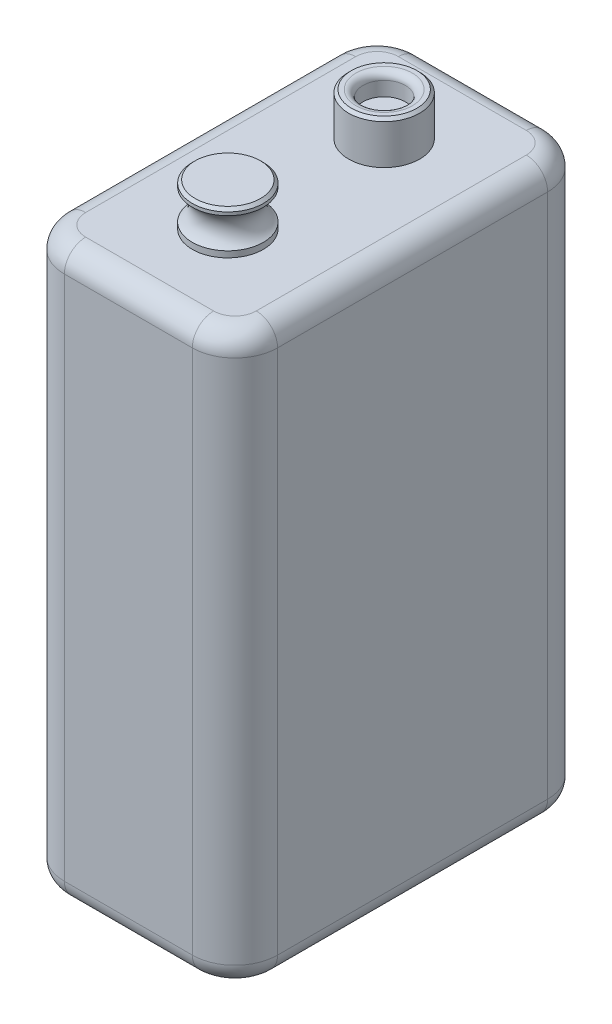
ISO-10303-21;
HEADER;
FILE_DESCRIPTION(('STEP AP214'),'2;1');
FILE_NAME('part.step','',(''),(''),'','','');
FILE_SCHEMA(('AUTOMOTIVE_DESIGN { 1 0 10303 214 1 1 1 1 }'));
ENDSEC;
DATA;
#1=APPLICATION_CONTEXT('core data for automotive mechanical design processes');
#2=APPLICATION_PROTOCOL_DEFINITION('international standard','automotive_design',2000,#1);
#3=PRODUCT_CONTEXT('',#1,'mechanical');
#4=PRODUCT('Part','Part','',(#3));
#5=PRODUCT_RELATED_PRODUCT_CATEGORY('part','',(#4));
#6=PRODUCT_DEFINITION_FORMATION('','',#4);
#7=PRODUCT_DEFINITION_CONTEXT('part definition',#1,'design');
#8=PRODUCT_DEFINITION('design','',#6,#7);
#9=PRODUCT_DEFINITION_SHAPE('','',#8);
#10=(LENGTH_UNIT() NAMED_UNIT(*) SI_UNIT(.MILLI.,.METRE.));
#11=(NAMED_UNIT(*) PLANE_ANGLE_UNIT() SI_UNIT($,.RADIAN.));
#12=(NAMED_UNIT(*) SI_UNIT($,.STERADIAN.) SOLID_ANGLE_UNIT());
#13=UNCERTAINTY_MEASURE_WITH_UNIT(LENGTH_MEASURE(1.E-05),#10,'distance_accuracy_value','');
#14=(GEOMETRIC_REPRESENTATION_CONTEXT(3) GLOBAL_UNCERTAINTY_ASSIGNED_CONTEXT((#13)) GLOBAL_UNIT_ASSIGNED_CONTEXT((#10,
#11,#12)) REPRESENTATION_CONTEXT('',''));
#15=CARTESIAN_POINT('',(0.,0.,0.));
#16=DIRECTION('',(0.,0.,1.));
#17=DIRECTION('',(1.,0.,0.));
#18=AXIS2_PLACEMENT_3D('',#15,#16,#17);
#19=CARTESIAN_POINT('',(0.,43.,5.49999999999999));
#20=DIRECTION('',(0.,-1.,0.));
#21=DIRECTION('',(0.,0.,-1.));
#22=AXIS2_PLACEMENT_3D('',#19,#20,#21);
#23=CYLINDRICAL_SURFACE('',#22,2.5);
#24=CARTESIAN_POINT('',(0.,40.,5.49999999999999));
#25=DIRECTION('',(0.,1.,0.));
#26=DIRECTION('',(0.,0.,-1.));
#27=AXIS2_PLACEMENT_3D('',#24,#25,#26);
#28=CIRCLE('',#27,2.5);
#29=CARTESIAN_POINT('',(0.,40.,2.99999999999999));
#30=VERTEX_POINT('',#29);
#31=EDGE_CURVE('E458',#30,#30,#28,.T.);
#32=ORIENTED_EDGE('',*,*,#31,.T.);
#33=EDGE_LOOP('',(#32));
#34=FACE_BOUND('',#33,.T.);
#35=CARTESIAN_POINT('',(0.,40.4314612308124,5.49999999999999));
#36=DIRECTION('',(0.,1.,0.));
#37=DIRECTION('',(0.,0.,1.));
#38=AXIS2_PLACEMENT_3D('',#35,#36,#37);
#39=CIRCLE('',#38,2.5);
#40=CARTESIAN_POINT('',(0.,40.4314612308124,7.99999999999999));
#41=VERTEX_POINT('',#40);
#42=EDGE_CURVE('E298',#41,#41,#39,.T.);
#43=ORIENTED_EDGE('',*,*,#42,.F.);
#44=EDGE_LOOP('',(#43));
#45=FACE_BOUND('',#44,.T.);
#46=ADVANCED_FACE('F38',(#34,#45),#23,.T.);
#47=CARTESIAN_POINT('',(7.5,40.,-12.5));
#48=DIRECTION('',(-1.,0.,0.));
#49=DIRECTION('',(0.,0.,1.));
#50=AXIS2_PLACEMENT_3D('',#47,#48,#49);
#51=PLANE('',#50);
#52=DIRECTION('',(0.,-1.,0.));
#53=VECTOR('',#52,1.);
#54=CARTESIAN_POINT('',(7.5,40.,-9.50000000000001));
#55=LINE('',#54,#53);
#56=CARTESIAN_POINT('',(7.5,1.5,-9.50000000000001));
#57=VERTEX_POINT('',#56);
#58=CARTESIAN_POINT('',(7.5,38.5,-9.50000000000001));
#59=VERTEX_POINT('',#58);
#60=EDGE_CURVE('E474',#57,#59,#55,.F.);
#61=ORIENTED_EDGE('',*,*,#60,.T.);
#62=DIRECTION('',(0.,0.,-1.));
#63=VECTOR('',#62,1.);
#64=CARTESIAN_POINT('',(7.5,38.5,9.49999999999999));
#65=LINE('',#64,#63);
#66=CARTESIAN_POINT('',(7.5,38.5,9.49999999999999));
#67=VERTEX_POINT('',#66);
#68=EDGE_CURVE('E262',#59,#67,#65,.F.);
#69=ORIENTED_EDGE('',*,*,#68,.T.);
#70=DIRECTION('',(0.,-1.,0.));
#71=VECTOR('',#70,1.);
#72=CARTESIAN_POINT('',(7.5,40.,9.49999999999999));
#73=LINE('',#72,#71);
#74=CARTESIAN_POINT('',(7.5,1.5,9.49999999999999));
#75=VERTEX_POINT('',#74);
#76=EDGE_CURVE('E472',#67,#75,#73,.T.);
#77=ORIENTED_EDGE('',*,*,#76,.T.);
#78=DIRECTION('',(0.,0.,-1.));
#79=VECTOR('',#78,1.);
#80=CARTESIAN_POINT('',(7.5,1.5,-12.5));
#81=LINE('',#80,#79);
#82=EDGE_CURVE('E213',#75,#57,#81,.T.);
#83=ORIENTED_EDGE('',*,*,#82,.T.);
#84=EDGE_LOOP('',(#61,#69,#77,#83));
#85=FACE_BOUND('',#84,.T.);
#86=ADVANCED_FACE('F319',(#85),#51,.F.);
#87=CARTESIAN_POINT('',(-7.5,40.,-12.5));
#88=DIRECTION('',(0.,0.,1.));
#89=DIRECTION('',(1.,0.,0.));
#90=AXIS2_PLACEMENT_3D('',#87,#88,#89);
#91=PLANE('',#90);
#92=DIRECTION('',(0.,-1.,0.));
#93=VECTOR('',#92,1.);
#94=CARTESIAN_POINT('',(-4.5,40.,-12.5));
#95=LINE('',#94,#93);
#96=CARTESIAN_POINT('',(-4.5,1.5,-12.5));
#97=VERTEX_POINT('',#96);
#98=CARTESIAN_POINT('',(-4.5,38.5,-12.5));
#99=VERTEX_POINT('',#98);
#100=EDGE_CURVE('E470',#97,#99,#95,.F.);
#101=ORIENTED_EDGE('',*,*,#100,.T.);
#102=DIRECTION('',(-1.,0.,0.));
#103=VECTOR('',#102,1.);
#104=CARTESIAN_POINT('',(4.5,38.5,-12.5));
#105=LINE('',#104,#103);
#106=CARTESIAN_POINT('',(4.5,38.5,-12.5));
#107=VERTEX_POINT('',#106);
#108=EDGE_CURVE('E61',#99,#107,#105,.F.);
#109=ORIENTED_EDGE('',*,*,#108,.T.);
#110=DIRECTION('',(0.,-1.,0.));
#111=VECTOR('',#110,1.);
#112=CARTESIAN_POINT('',(4.5,40.,-12.5));
#113=LINE('',#112,#111);
#114=CARTESIAN_POINT('',(4.5,1.5,-12.5));
#115=VERTEX_POINT('',#114);
#116=EDGE_CURVE('E468',#107,#115,#113,.T.);
#117=ORIENTED_EDGE('',*,*,#116,.T.);
#118=DIRECTION('',(-1.,0.,0.));
#119=VECTOR('',#118,1.);
#120=CARTESIAN_POINT('',(-7.5,1.5,-12.5));
#121=LINE('',#120,#119);
#122=EDGE_CURVE('E210',#115,#97,#121,.T.);
#123=ORIENTED_EDGE('',*,*,#122,.T.);
#124=EDGE_LOOP('',(#101,#109,#117,#123));
#125=FACE_BOUND('',#124,.T.);
#126=ADVANCED_FACE('F324',(#125),#91,.F.);
#127=CARTESIAN_POINT('',(-7.5,40.,-12.5));
#128=DIRECTION('',(1.,0.,0.));
#129=DIRECTION('',(0.,0.,-1.));
#130=AXIS2_PLACEMENT_3D('',#127,#128,#129);
#131=PLANE('',#130);
#132=DIRECTION('',(0.,-1.,0.));
#133=VECTOR('',#132,1.);
#134=CARTESIAN_POINT('',(-7.5,40.,9.49999999999999));
#135=LINE('',#134,#133);
#136=CARTESIAN_POINT('',(-7.5,1.5,9.49999999999999));
#137=VERTEX_POINT('',#136);
#138=CARTESIAN_POINT('',(-7.5,38.5,9.49999999999999));
#139=VERTEX_POINT('',#138);
#140=EDGE_CURVE('E232',#137,#139,#135,.F.);
#141=ORIENTED_EDGE('',*,*,#140,.T.);
#142=DIRECTION('',(0.,0.,1.));
#143=VECTOR('',#142,1.);
#144=CARTESIAN_POINT('',(-7.5,38.5,-9.50000000000001));
#145=LINE('',#144,#143);
#146=CARTESIAN_POINT('',(-7.5,38.5,-9.50000000000001));
#147=VERTEX_POINT('',#146);
#148=EDGE_CURVE('E256',#139,#147,#145,.F.);
#149=ORIENTED_EDGE('',*,*,#148,.T.);
#150=DIRECTION('',(0.,-1.,0.));
#151=VECTOR('',#150,1.);
#152=CARTESIAN_POINT('',(-7.5,40.,-9.50000000000001));
#153=LINE('',#152,#151);
#154=CARTESIAN_POINT('',(-7.5,1.5,-9.50000000000001));
#155=VERTEX_POINT('',#154);
#156=EDGE_CURVE('E466',#147,#155,#153,.T.);
#157=ORIENTED_EDGE('',*,*,#156,.T.);
#158=DIRECTION('',(0.,0.,1.));
#159=VECTOR('',#158,1.);
#160=CARTESIAN_POINT('',(-7.5,1.5,-12.5));
#161=LINE('',#160,#159);
#162=EDGE_CURVE('E205',#155,#137,#161,.T.);
#163=ORIENTED_EDGE('',*,*,#162,.T.);
#164=EDGE_LOOP('',(#141,#149,#157,#163));
#165=FACE_BOUND('',#164,.T.);
#166=ADVANCED_FACE('F352',(#165),#131,.F.);
#167=CARTESIAN_POINT('',(-7.5,40.,12.5));
#168=DIRECTION('',(0.,0.,-1.));
#169=DIRECTION('',(-1.,0.,0.));
#170=AXIS2_PLACEMENT_3D('',#167,#168,#169);
#171=PLANE('',#170);
#172=DIRECTION('',(0.,-1.,0.));
#173=VECTOR('',#172,1.);
#174=CARTESIAN_POINT('',(4.5,40.,12.5));
#175=LINE('',#174,#173);
#176=CARTESIAN_POINT('',(4.5,1.5,12.5));
#177=VERTEX_POINT('',#176);
#178=CARTESIAN_POINT('',(4.5,38.5,12.5));
#179=VERTEX_POINT('',#178);
#180=EDGE_CURVE('E182',#177,#179,#175,.F.);
#181=ORIENTED_EDGE('',*,*,#180,.T.);
#182=DIRECTION('',(1.,0.,0.));
#183=VECTOR('',#182,1.);
#184=CARTESIAN_POINT('',(-4.5,38.5,12.5));
#185=LINE('',#184,#183);
#186=CARTESIAN_POINT('',(-4.5,38.5,12.5));
#187=VERTEX_POINT('',#186);
#188=EDGE_CURVE('E252',#179,#187,#185,.F.);
#189=ORIENTED_EDGE('',*,*,#188,.T.);
#190=DIRECTION('',(0.,-1.,0.));
#191=VECTOR('',#190,1.);
#192=CARTESIAN_POINT('',(-4.5,40.,12.5));
#193=LINE('',#192,#191);
#194=CARTESIAN_POINT('',(-4.5,1.5,12.5));
#195=VERTEX_POINT('',#194);
#196=EDGE_CURVE('E180',#187,#195,#193,.T.);
#197=ORIENTED_EDGE('',*,*,#196,.T.);
#198=DIRECTION('',(1.,0.,0.));
#199=VECTOR('',#198,1.);
#200=CARTESIAN_POINT('',(-7.5,1.5,12.5));
#201=LINE('',#200,#199);
#202=EDGE_CURVE('E200',#195,#177,#201,.T.);
#203=ORIENTED_EDGE('',*,*,#202,.T.);
#204=EDGE_LOOP('',(#181,#189,#197,#203));
#205=FACE_BOUND('',#204,.T.);
#206=ADVANCED_FACE('F345',(#205),#171,.F.);
#207=CARTESIAN_POINT('',(0.,40.,0.));
#208=DIRECTION('',(0.,1.,0.));
#209=DIRECTION('',(0.,0.,1.));
#210=AXIS2_PLACEMENT_3D('',#207,#208,#209);
#211=PLANE('',#210);
#212=ORIENTED_EDGE('',*,*,#31,.F.);
#213=EDGE_LOOP('',(#212));
#214=FACE_BOUND('',#213,.T.);
#215=CARTESIAN_POINT('',(0.,40.,-5.5));
#216=DIRECTION('',(0.,1.,0.));
#217=DIRECTION('',(0.,0.,1.));
#218=AXIS2_PLACEMENT_3D('',#215,#216,#217);
#219=CIRCLE('',#218,2.5);
#220=CARTESIAN_POINT('',(0.,40.,-3.));
#221=VERTEX_POINT('',#220);
#222=EDGE_CURVE('E268',#221,#221,#219,.T.);
#223=ORIENTED_EDGE('',*,*,#222,.F.);
#224=EDGE_LOOP('',(#223));
#225=FACE_BOUND('',#224,.T.);
#226=DIRECTION('',(1.,0.,0.));
#227=VECTOR('',#226,1.);
#228=CARTESIAN_POINT('',(4.5,40.,11.));
#229=LINE('',#228,#227);
#230=CARTESIAN_POINT('',(-4.5,40.,11.));
#231=VERTEX_POINT('',#230);
#232=CARTESIAN_POINT('',(4.5,40.,11.));
#233=VERTEX_POINT('',#232);
#234=EDGE_CURVE('E244',#231,#233,#229,.T.);
#235=ORIENTED_EDGE('',*,*,#234,.T.);
#236=CARTESIAN_POINT('',(4.5,40.,9.49999999999999));
#237=DIRECTION('',(0.,1.,0.));
#238=DIRECTION('',(0.,0.,1.));
#239=AXIS2_PLACEMENT_3D('',#236,#237,#238);
#240=CIRCLE('',#239,1.5);
#241=CARTESIAN_POINT('',(6.,40.,9.49999999999999));
#242=VERTEX_POINT('',#241);
#243=EDGE_CURVE('E246',#233,#242,#240,.T.);
#244=ORIENTED_EDGE('',*,*,#243,.T.);
#245=DIRECTION('',(0.,0.,-1.));
#246=VECTOR('',#245,1.);
#247=CARTESIAN_POINT('',(6.,40.,-9.50000000000001));
#248=LINE('',#247,#246);
#249=CARTESIAN_POINT('',(6.,40.,-9.50000000000001));
#250=VERTEX_POINT('',#249);
#251=EDGE_CURVE('E215',#242,#250,#248,.T.);
#252=ORIENTED_EDGE('',*,*,#251,.T.);
#253=CARTESIAN_POINT('',(4.5,40.,-9.50000000000001));
#254=DIRECTION('',(0.,1.,0.));
#255=DIRECTION('',(0.,0.,1.));
#256=AXIS2_PLACEMENT_3D('',#253,#254,#255);
#257=CIRCLE('',#256,1.5);
#258=CARTESIAN_POINT('',(4.5,40.,-11.));
#259=VERTEX_POINT('',#258);
#260=EDGE_CURVE('E234',#250,#259,#257,.T.);
#261=ORIENTED_EDGE('',*,*,#260,.T.);
#262=DIRECTION('',(-1.,0.,0.));
#263=VECTOR('',#262,1.);
#264=CARTESIAN_POINT('',(-4.5,40.,-11.));
#265=LINE('',#264,#263);
#266=CARTESIAN_POINT('',(-4.5,40.,-11.));
#267=VERTEX_POINT('',#266);
#268=EDGE_CURVE('E236',#259,#267,#265,.T.);
#269=ORIENTED_EDGE('',*,*,#268,.T.);
#270=CARTESIAN_POINT('',(-4.5,40.,-9.50000000000001));
#271=DIRECTION('',(0.,1.,0.));
#272=DIRECTION('',(0.,0.,1.));
#273=AXIS2_PLACEMENT_3D('',#270,#271,#272);
#274=CIRCLE('',#273,1.5);
#275=CARTESIAN_POINT('',(-6.,40.,-9.50000000000001));
#276=VERTEX_POINT('',#275);
#277=EDGE_CURVE('E238',#267,#276,#274,.T.);
#278=ORIENTED_EDGE('',*,*,#277,.T.);
#279=DIRECTION('',(0.,0.,1.));
#280=VECTOR('',#279,1.);
#281=CARTESIAN_POINT('',(-6.,40.,9.49999999999999));
#282=LINE('',#281,#280);
#283=CARTESIAN_POINT('',(-6.,40.,9.49999999999999));
#284=VERTEX_POINT('',#283);
#285=EDGE_CURVE('E240',#276,#284,#282,.T.);
#286=ORIENTED_EDGE('',*,*,#285,.T.);
#287=CARTESIAN_POINT('',(-4.5,40.,9.49999999999999));
#288=DIRECTION('',(0.,1.,0.));
#289=DIRECTION('',(0.,0.,1.));
#290=AXIS2_PLACEMENT_3D('',#287,#288,#289);
#291=CIRCLE('',#290,1.5);
#292=EDGE_CURVE('E242',#284,#231,#291,.T.);
#293=ORIENTED_EDGE('',*,*,#292,.T.);
#294=EDGE_LOOP('',(#235,#244,#252,#261,#269,#278,#286,#293));
#295=FACE_BOUND('',#294,.T.);
#296=ADVANCED_FACE('F342',(#214,#225,#295),#211,.T.);
#297=CARTESIAN_POINT('',(0.,0.,0.));
#298=DIRECTION('',(0.,1.,0.));
#299=DIRECTION('',(0.,0.,1.));
#300=AXIS2_PLACEMENT_3D('',#297,#298,#299);
#301=PLANE('',#300);
#302=DIRECTION('',(0.,0.,-1.));
#303=VECTOR('',#302,1.);
#304=CARTESIAN_POINT('',(6.,0.,0.));
#305=LINE('',#304,#303);
#306=CARTESIAN_POINT('',(6.,0.,-9.50000000000001));
#307=VERTEX_POINT('',#306);
#308=CARTESIAN_POINT('',(6.,0.,9.49999999999999));
#309=VERTEX_POINT('',#308);
#310=EDGE_CURVE('E157',#307,#309,#305,.F.);
#311=ORIENTED_EDGE('',*,*,#310,.T.);
#312=CARTESIAN_POINT('',(4.5,0.,9.49999999999999));
#313=DIRECTION('',(0.,1.,0.));
#314=DIRECTION('',(0.,0.,1.));
#315=AXIS2_PLACEMENT_3D('',#312,#313,#314);
#316=CIRCLE('',#315,1.5);
#317=CARTESIAN_POINT('',(4.5,0.,11.));
#318=VERTEX_POINT('',#317);
#319=EDGE_CURVE('E195',#309,#318,#316,.F.);
#320=ORIENTED_EDGE('',*,*,#319,.T.);
#321=DIRECTION('',(1.,0.,0.));
#322=VECTOR('',#321,1.);
#323=CARTESIAN_POINT('',(0.,0.,11.));
#324=LINE('',#323,#322);
#325=CARTESIAN_POINT('',(-4.5,0.,11.));
#326=VERTEX_POINT('',#325);
#327=EDGE_CURVE('E193',#318,#326,#324,.F.);
#328=ORIENTED_EDGE('',*,*,#327,.T.);
#329=CARTESIAN_POINT('',(-4.5,0.,9.49999999999999));
#330=DIRECTION('',(0.,1.,0.));
#331=DIRECTION('',(0.,0.,1.));
#332=AXIS2_PLACEMENT_3D('',#329,#330,#331);
#333=CIRCLE('',#332,1.5);
#334=CARTESIAN_POINT('',(-6.,0.,9.49999999999999));
#335=VERTEX_POINT('',#334);
#336=EDGE_CURVE('E191',#326,#335,#333,.F.);
#337=ORIENTED_EDGE('',*,*,#336,.T.);
#338=DIRECTION('',(0.,0.,1.));
#339=VECTOR('',#338,1.);
#340=CARTESIAN_POINT('',(-6.,0.,0.));
#341=LINE('',#340,#339);
#342=CARTESIAN_POINT('',(-6.,0.,-9.50000000000001));
#343=VERTEX_POINT('',#342);
#344=EDGE_CURVE('E189',#335,#343,#341,.F.);
#345=ORIENTED_EDGE('',*,*,#344,.T.);
#346=CARTESIAN_POINT('',(-4.5,0.,-9.50000000000001));
#347=DIRECTION('',(0.,1.,0.));
#348=DIRECTION('',(0.,0.,1.));
#349=AXIS2_PLACEMENT_3D('',#346,#347,#348);
#350=CIRCLE('',#349,1.5);
#351=CARTESIAN_POINT('',(-4.5,0.,-11.));
#352=VERTEX_POINT('',#351);
#353=EDGE_CURVE('E187',#343,#352,#350,.F.);
#354=ORIENTED_EDGE('',*,*,#353,.T.);
#355=DIRECTION('',(-1.,0.,0.));
#356=VECTOR('',#355,1.);
#357=CARTESIAN_POINT('',(0.,0.,-11.));
#358=LINE('',#357,#356);
#359=CARTESIAN_POINT('',(4.5,0.,-11.));
#360=VERTEX_POINT('',#359);
#361=EDGE_CURVE('E160',#352,#360,#358,.F.);
#362=ORIENTED_EDGE('',*,*,#361,.T.);
#363=CARTESIAN_POINT('',(4.5,0.,-9.50000000000001));
#364=DIRECTION('',(0.,1.,0.));
#365=DIRECTION('',(0.,0.,1.));
#366=AXIS2_PLACEMENT_3D('',#363,#364,#365);
#367=CIRCLE('',#366,1.5);
#368=EDGE_CURVE('E152',#360,#307,#367,.F.);
#369=ORIENTED_EDGE('',*,*,#368,.T.);
#370=EDGE_LOOP('',(#311,#320,#328,#337,#345,#354,#362,#369));
#371=FACE_BOUND('',#370,.T.);
#372=ADVANCED_FACE('F154',(#371),#301,.F.);
#373=CARTESIAN_POINT('',(-4.5,40.,-9.50000000000001));
#374=DIRECTION('',(0.,-1.,0.));
#375=DIRECTION('',(0.,0.,-1.));
#376=AXIS2_PLACEMENT_3D('',#373,#374,#375);
#377=CYLINDRICAL_SURFACE('',#376,3.);
#378=ORIENTED_EDGE('',*,*,#156,.F.);
#379=CARTESIAN_POINT('',(-4.5,38.5,-9.50000000000001));
#380=DIRECTION('',(0.,1.,0.));
#381=DIRECTION('',(0.,0.,1.));
#382=AXIS2_PLACEMENT_3D('',#379,#380,#381);
#383=CIRCLE('',#382,3.);
#384=EDGE_CURVE('E258',#147,#99,#383,.F.);
#385=ORIENTED_EDGE('',*,*,#384,.T.);
#386=ORIENTED_EDGE('',*,*,#100,.F.);
#387=CARTESIAN_POINT('',(-4.5,1.5,-9.50000000000001));
#388=DIRECTION('',(0.,1.,0.));
#389=DIRECTION('',(0.,0.,1.));
#390=AXIS2_PLACEMENT_3D('',#387,#388,#389);
#391=CIRCLE('',#390,3.);
#392=EDGE_CURVE('E207',#97,#155,#391,.T.);
#393=ORIENTED_EDGE('',*,*,#392,.T.);
#394=EDGE_LOOP('',(#378,#385,#386,#393));
#395=FACE_BOUND('',#394,.T.);
#396=ADVANCED_FACE('F349',(#395),#377,.T.);
#397=CARTESIAN_POINT('',(4.5,40.,-9.50000000000001));
#398=DIRECTION('',(0.,-1.,0.));
#399=DIRECTION('',(0.,0.,-1.));
#400=AXIS2_PLACEMENT_3D('',#397,#398,#399);
#401=CYLINDRICAL_SURFACE('',#400,3.);
#402=ORIENTED_EDGE('',*,*,#116,.F.);
#403=CARTESIAN_POINT('',(4.5,38.5,-9.50000000000001));
#404=DIRECTION('',(0.,1.,0.));
#405=DIRECTION('',(0.,0.,1.));
#406=AXIS2_PLACEMENT_3D('',#403,#404,#405);
#407=CIRCLE('',#406,3.);
#408=EDGE_CURVE('E53',#107,#59,#407,.F.);
#409=ORIENTED_EDGE('',*,*,#408,.T.);
#410=ORIENTED_EDGE('',*,*,#60,.F.);
#411=CARTESIAN_POINT('',(4.5,1.5,-9.50000000000001));
#412=DIRECTION('',(0.,1.,0.));
#413=DIRECTION('',(0.,0.,1.));
#414=AXIS2_PLACEMENT_3D('',#411,#412,#413);
#415=CIRCLE('',#414,3.);
#416=EDGE_CURVE('E170',#57,#115,#415,.T.);
#417=ORIENTED_EDGE('',*,*,#416,.T.);
#418=EDGE_LOOP('',(#402,#409,#410,#417));
#419=FACE_BOUND('',#418,.T.);
#420=ADVANCED_FACE('F361',(#419),#401,.T.);
#421=CARTESIAN_POINT('',(-4.5,40.,9.49999999999999));
#422=DIRECTION('',(0.,-1.,0.));
#423=DIRECTION('',(0.,0.,-1.));
#424=AXIS2_PLACEMENT_3D('',#421,#422,#423);
#425=CYLINDRICAL_SURFACE('',#424,3.);
#426=ORIENTED_EDGE('',*,*,#196,.F.);
#427=CARTESIAN_POINT('',(-4.5,38.5,9.49999999999999));
#428=DIRECTION('',(0.,1.,0.));
#429=DIRECTION('',(0.,0.,1.));
#430=AXIS2_PLACEMENT_3D('',#427,#428,#429);
#431=CIRCLE('',#430,3.);
#432=EDGE_CURVE('E254',#187,#139,#431,.F.);
#433=ORIENTED_EDGE('',*,*,#432,.T.);
#434=ORIENTED_EDGE('',*,*,#140,.F.);
#435=CARTESIAN_POINT('',(-4.5,1.5,9.49999999999999));
#436=DIRECTION('',(0.,1.,0.));
#437=DIRECTION('',(0.,0.,1.));
#438=AXIS2_PLACEMENT_3D('',#435,#436,#437);
#439=CIRCLE('',#438,3.);
#440=EDGE_CURVE('E202',#137,#195,#439,.T.);
#441=ORIENTED_EDGE('',*,*,#440,.T.);
#442=EDGE_LOOP('',(#426,#433,#434,#441));
#443=FACE_BOUND('',#442,.T.);
#444=ADVANCED_FACE('F365',(#443),#425,.T.);
#445=CARTESIAN_POINT('',(4.5,40.,9.49999999999999));
#446=DIRECTION('',(0.,-1.,0.));
#447=DIRECTION('',(0.,0.,-1.));
#448=AXIS2_PLACEMENT_3D('',#445,#446,#447);
#449=CYLINDRICAL_SURFACE('',#448,3.);
#450=ORIENTED_EDGE('',*,*,#76,.F.);
#451=CARTESIAN_POINT('',(4.5,38.5,9.49999999999999));
#452=DIRECTION('',(0.,1.,0.));
#453=DIRECTION('',(0.,0.,1.));
#454=AXIS2_PLACEMENT_3D('',#451,#452,#453);
#455=CIRCLE('',#454,3.);
#456=EDGE_CURVE('E249',#67,#179,#455,.F.);
#457=ORIENTED_EDGE('',*,*,#456,.T.);
#458=ORIENTED_EDGE('',*,*,#180,.F.);
#459=CARTESIAN_POINT('',(4.5,1.5,9.49999999999999));
#460=DIRECTION('',(0.,1.,0.));
#461=DIRECTION('',(0.,0.,1.));
#462=AXIS2_PLACEMENT_3D('',#459,#460,#461);
#463=CIRCLE('',#462,3.);
#464=EDGE_CURVE('E197',#177,#75,#463,.T.);
#465=ORIENTED_EDGE('',*,*,#464,.T.);
#466=EDGE_LOOP('',(#450,#457,#458,#465));
#467=FACE_BOUND('',#466,.T.);
#468=ADVANCED_FACE('F368',(#467),#449,.T.);
#469=CARTESIAN_POINT('',(-4.5,1.5,-9.50000000000001));
#470=DIRECTION('',(0.,1.,0.));
#471=DIRECTION('',(0.,0.,1.));
#472=AXIS2_PLACEMENT_3D('',#469,#470,#471);
#473=DEGENERATE_TOROIDAL_SURFACE('',#472,1.5,1.5,.T.);
#474=CARTESIAN_POINT('',(-6.,1.5,-9.50000000000001));
#475=DIRECTION('',(0.,0.,1.));
#476=DIRECTION('',(1.,0.,0.));
#477=AXIS2_PLACEMENT_3D('',#474,#475,#476);
#478=CIRCLE('',#477,1.5);
#479=EDGE_CURVE('E226',#155,#343,#478,.T.);
#480=ORIENTED_EDGE('',*,*,#479,.F.);
#481=ORIENTED_EDGE('',*,*,#392,.F.);
#482=CARTESIAN_POINT('',(-4.5,1.5,-11.));
#483=DIRECTION('',(1.,0.,0.));
#484=DIRECTION('',(0.,0.,-1.));
#485=AXIS2_PLACEMENT_3D('',#482,#483,#484);
#486=CIRCLE('',#485,1.5);
#487=EDGE_CURVE('E229',#352,#97,#486,.T.);
#488=ORIENTED_EDGE('',*,*,#487,.F.);
#489=ORIENTED_EDGE('',*,*,#353,.F.);
#490=EDGE_LOOP('',(#480,#481,#488,#489));
#491=FACE_BOUND('',#490,.T.);
#492=ADVANCED_FACE('F372',(#491),#473,.T.);
#493=CARTESIAN_POINT('',(-7.5,1.5,-11.));
#494=DIRECTION('',(-1.,0.,0.));
#495=DIRECTION('',(0.,0.,1.));
#496=AXIS2_PLACEMENT_3D('',#493,#494,#495);
#497=CYLINDRICAL_SURFACE('',#496,1.5);
#498=ORIENTED_EDGE('',*,*,#487,.T.);
#499=ORIENTED_EDGE('',*,*,#122,.F.);
#500=CARTESIAN_POINT('',(4.5,1.5,-11.));
#501=DIRECTION('',(1.,0.,0.));
#502=DIRECTION('',(0.,0.,-1.));
#503=AXIS2_PLACEMENT_3D('',#500,#501,#502);
#504=CIRCLE('',#503,1.5);
#505=EDGE_CURVE('E224',#360,#115,#504,.T.);
#506=ORIENTED_EDGE('',*,*,#505,.F.);
#507=ORIENTED_EDGE('',*,*,#361,.F.);
#508=EDGE_LOOP('',(#498,#499,#506,#507));
#509=FACE_BOUND('',#508,.T.);
#510=ADVANCED_FACE('F394',(#509),#497,.T.);
#511=CARTESIAN_POINT('',(-6.,1.5,-12.5));
#512=DIRECTION('',(0.,0.,1.));
#513=DIRECTION('',(1.,0.,0.));
#514=AXIS2_PLACEMENT_3D('',#511,#512,#513);
#515=CYLINDRICAL_SURFACE('',#514,1.5);
#516=ORIENTED_EDGE('',*,*,#479,.T.);
#517=ORIENTED_EDGE('',*,*,#344,.F.);
#518=CARTESIAN_POINT('',(-6.,1.5,9.49999999999999));
#519=DIRECTION('',(0.,0.,1.));
#520=DIRECTION('',(1.,0.,0.));
#521=AXIS2_PLACEMENT_3D('',#518,#519,#520);
#522=CIRCLE('',#521,1.5);
#523=EDGE_CURVE('E173',#137,#335,#522,.T.);
#524=ORIENTED_EDGE('',*,*,#523,.F.);
#525=ORIENTED_EDGE('',*,*,#162,.F.);
#526=EDGE_LOOP('',(#516,#517,#524,#525));
#527=FACE_BOUND('',#526,.T.);
#528=ADVANCED_FACE('F391',(#527),#515,.T.);
#529=CARTESIAN_POINT('',(4.5,1.5,-9.50000000000001));
#530=DIRECTION('',(0.,1.,0.));
#531=DIRECTION('',(0.,0.,1.));
#532=AXIS2_PLACEMENT_3D('',#529,#530,#531);
#533=DEGENERATE_TOROIDAL_SURFACE('',#532,1.5,1.5,.T.);
#534=ORIENTED_EDGE('',*,*,#505,.T.);
#535=ORIENTED_EDGE('',*,*,#416,.F.);
#536=CARTESIAN_POINT('',(6.,1.5,-9.50000000000001));
#537=DIRECTION('',(0.,0.,1.));
#538=DIRECTION('',(1.,0.,0.));
#539=AXIS2_PLACEMENT_3D('',#536,#537,#538);
#540=CIRCLE('',#539,1.5);
#541=EDGE_CURVE('E167',#307,#57,#540,.T.);
#542=ORIENTED_EDGE('',*,*,#541,.F.);
#543=ORIENTED_EDGE('',*,*,#368,.F.);
#544=EDGE_LOOP('',(#534,#535,#542,#543));
#545=FACE_BOUND('',#544,.T.);
#546=ADVANCED_FACE('F168',(#545),#533,.T.);
#547=CARTESIAN_POINT('',(-4.5,1.5,9.49999999999999));
#548=DIRECTION('',(0.,1.,0.));
#549=DIRECTION('',(0.,0.,1.));
#550=AXIS2_PLACEMENT_3D('',#547,#548,#549);
#551=DEGENERATE_TOROIDAL_SURFACE('',#550,1.5,1.5,.T.);
#552=ORIENTED_EDGE('',*,*,#523,.T.);
#553=ORIENTED_EDGE('',*,*,#336,.F.);
#554=CARTESIAN_POINT('',(-4.5,1.5,11.));
#555=DIRECTION('',(1.,0.,0.));
#556=DIRECTION('',(0.,0.,-1.));
#557=AXIS2_PLACEMENT_3D('',#554,#555,#556);
#558=CIRCLE('',#557,1.5);
#559=EDGE_CURVE('E174',#195,#326,#558,.T.);
#560=ORIENTED_EDGE('',*,*,#559,.F.);
#561=ORIENTED_EDGE('',*,*,#440,.F.);
#562=EDGE_LOOP('',(#552,#553,#560,#561));
#563=FACE_BOUND('',#562,.T.);
#564=ADVANCED_FACE('F385',(#563),#551,.T.);
#565=CARTESIAN_POINT('',(6.,1.5,-12.5));
#566=DIRECTION('',(0.,0.,-1.));
#567=DIRECTION('',(-1.,0.,0.));
#568=AXIS2_PLACEMENT_3D('',#565,#566,#567);
#569=CYLINDRICAL_SURFACE('',#568,1.5);
#570=ORIENTED_EDGE('',*,*,#541,.T.);
#571=ORIENTED_EDGE('',*,*,#82,.F.);
#572=CARTESIAN_POINT('',(6.,1.5,9.49999999999999));
#573=DIRECTION('',(0.,0.,1.));
#574=DIRECTION('',(1.,0.,0.));
#575=AXIS2_PLACEMENT_3D('',#572,#573,#574);
#576=CIRCLE('',#575,1.5);
#577=EDGE_CURVE('E178',#309,#75,#576,.T.);
#578=ORIENTED_EDGE('',*,*,#577,.F.);
#579=ORIENTED_EDGE('',*,*,#310,.F.);
#580=EDGE_LOOP('',(#570,#571,#578,#579));
#581=FACE_BOUND('',#580,.T.);
#582=ADVANCED_FACE('F176',(#581),#569,.T.);
#583=CARTESIAN_POINT('',(-7.5,1.5,11.));
#584=DIRECTION('',(1.,0.,0.));
#585=DIRECTION('',(0.,0.,-1.));
#586=AXIS2_PLACEMENT_3D('',#583,#584,#585);
#587=CYLINDRICAL_SURFACE('',#586,1.5);
#588=ORIENTED_EDGE('',*,*,#559,.T.);
#589=ORIENTED_EDGE('',*,*,#327,.F.);
#590=CARTESIAN_POINT('',(4.5,1.5,11.));
#591=DIRECTION('',(1.,0.,0.));
#592=DIRECTION('',(0.,1.,0.));
#593=AXIS2_PLACEMENT_3D('',#590,#591,#592);
#594=CIRCLE('',#593,1.5);
#595=EDGE_CURVE('E216',#177,#318,#594,.T.);
#596=ORIENTED_EDGE('',*,*,#595,.F.);
#597=ORIENTED_EDGE('',*,*,#202,.F.);
#598=EDGE_LOOP('',(#588,#589,#596,#597));
#599=FACE_BOUND('',#598,.T.);
#600=ADVANCED_FACE('F378',(#599),#587,.T.);
#601=CARTESIAN_POINT('',(4.5,1.5,9.49999999999999));
#602=DIRECTION('',(0.,1.,0.));
#603=DIRECTION('',(0.,0.,1.));
#604=AXIS2_PLACEMENT_3D('',#601,#602,#603);
#605=DEGENERATE_TOROIDAL_SURFACE('',#604,1.5,1.5,.T.);
#606=ORIENTED_EDGE('',*,*,#577,.T.);
#607=ORIENTED_EDGE('',*,*,#464,.F.);
#608=ORIENTED_EDGE('',*,*,#595,.T.);
#609=ORIENTED_EDGE('',*,*,#319,.F.);
#610=EDGE_LOOP('',(#606,#607,#608,#609));
#611=FACE_BOUND('',#610,.T.);
#612=ADVANCED_FACE('F374',(#611),#605,.T.);
#613=CARTESIAN_POINT('',(-4.5,38.5,-9.50000000000001));
#614=DIRECTION('',(0.,1.,0.));
#615=DIRECTION('',(0.,0.,1.));
#616=AXIS2_PLACEMENT_3D('',#613,#614,#615);
#617=DEGENERATE_TOROIDAL_SURFACE('',#616,1.5,1.5,.T.);
#618=CARTESIAN_POINT('',(-4.5,38.5,-11.));
#619=DIRECTION('',(1.,0.,0.));
#620=DIRECTION('',(0.,0.,-1.));
#621=AXIS2_PLACEMENT_3D('',#618,#619,#620);
#622=CIRCLE('',#621,1.5);
#623=EDGE_CURVE('E282',#99,#267,#622,.T.);
#624=ORIENTED_EDGE('',*,*,#623,.F.);
#625=ORIENTED_EDGE('',*,*,#384,.F.);
#626=CARTESIAN_POINT('',(-6.,38.5,-9.50000000000001));
#627=DIRECTION('',(0.,0.,1.));
#628=DIRECTION('',(1.,0.,0.));
#629=AXIS2_PLACEMENT_3D('',#626,#627,#628);
#630=CIRCLE('',#629,1.5);
#631=EDGE_CURVE('E218',#276,#147,#630,.T.);
#632=ORIENTED_EDGE('',*,*,#631,.F.);
#633=ORIENTED_EDGE('',*,*,#277,.F.);
#634=EDGE_LOOP('',(#624,#625,#632,#633));
#635=FACE_BOUND('',#634,.T.);
#636=ADVANCED_FACE('F377',(#635),#617,.T.);
#637=CARTESIAN_POINT('',(-6.,38.5,0.));
#638=DIRECTION('',(0.,0.,-1.));
#639=DIRECTION('',(-1.,0.,0.));
#640=AXIS2_PLACEMENT_3D('',#637,#638,#639);
#641=CYLINDRICAL_SURFACE('',#640,1.5);
#642=ORIENTED_EDGE('',*,*,#631,.T.);
#643=ORIENTED_EDGE('',*,*,#148,.F.);
#644=CARTESIAN_POINT('',(-6.,38.5,9.49999999999999));
#645=DIRECTION('',(0.,0.,1.));
#646=DIRECTION('',(1.,0.,0.));
#647=AXIS2_PLACEMENT_3D('',#644,#645,#646);
#648=CIRCLE('',#647,1.5);
#649=EDGE_CURVE('E279',#284,#139,#648,.T.);
#650=ORIENTED_EDGE('',*,*,#649,.F.);
#651=ORIENTED_EDGE('',*,*,#285,.F.);
#652=EDGE_LOOP('',(#642,#643,#650,#651));
#653=FACE_BOUND('',#652,.T.);
#654=ADVANCED_FACE('F424',(#653),#641,.T.);
#655=CARTESIAN_POINT('',(0.,38.5,-11.));
#656=DIRECTION('',(1.,0.,0.));
#657=DIRECTION('',(0.,0.,-1.));
#658=AXIS2_PLACEMENT_3D('',#655,#656,#657);
#659=CYLINDRICAL_SURFACE('',#658,1.5);
#660=ORIENTED_EDGE('',*,*,#623,.T.);
#661=ORIENTED_EDGE('',*,*,#268,.F.);
#662=CARTESIAN_POINT('',(4.5,38.5,-11.));
#663=DIRECTION('',(1.,0.,0.));
#664=DIRECTION('',(0.,0.,-1.));
#665=AXIS2_PLACEMENT_3D('',#662,#663,#664);
#666=CIRCLE('',#665,1.5);
#667=EDGE_CURVE('E276',#107,#259,#666,.T.);
#668=ORIENTED_EDGE('',*,*,#667,.F.);
#669=ORIENTED_EDGE('',*,*,#108,.F.);
#670=EDGE_LOOP('',(#660,#661,#668,#669));
#671=FACE_BOUND('',#670,.T.);
#672=ADVANCED_FACE('F420',(#671),#659,.T.);
#673=CARTESIAN_POINT('',(-4.5,38.5,9.49999999999999));
#674=DIRECTION('',(0.,1.,0.));
#675=DIRECTION('',(0.,0.,1.));
#676=AXIS2_PLACEMENT_3D('',#673,#674,#675);
#677=DEGENERATE_TOROIDAL_SURFACE('',#676,1.5,1.5,.T.);
#678=ORIENTED_EDGE('',*,*,#649,.T.);
#679=ORIENTED_EDGE('',*,*,#432,.F.);
#680=CARTESIAN_POINT('',(-4.5,38.5,11.));
#681=DIRECTION('',(1.,0.,0.));
#682=DIRECTION('',(0.,0.,-1.));
#683=AXIS2_PLACEMENT_3D('',#680,#681,#682);
#684=CIRCLE('',#683,1.5);
#685=EDGE_CURVE('E273',#231,#187,#684,.T.);
#686=ORIENTED_EDGE('',*,*,#685,.F.);
#687=ORIENTED_EDGE('',*,*,#292,.F.);
#688=EDGE_LOOP('',(#678,#679,#686,#687));
#689=FACE_BOUND('',#688,.T.);
#690=ADVANCED_FACE('F416',(#689),#677,.T.);
#691=CARTESIAN_POINT('',(4.5,38.5,-9.50000000000001));
#692=DIRECTION('',(0.,1.,0.));
#693=DIRECTION('',(0.,0.,1.));
#694=AXIS2_PLACEMENT_3D('',#691,#692,#693);
#695=DEGENERATE_TOROIDAL_SURFACE('',#694,1.5,1.5,.T.);
#696=ORIENTED_EDGE('',*,*,#667,.T.);
#697=ORIENTED_EDGE('',*,*,#260,.F.);
#698=CARTESIAN_POINT('',(6.,38.5,-9.50000000000001));
#699=DIRECTION('',(0.,0.,1.));
#700=DIRECTION('',(1.,0.,0.));
#701=AXIS2_PLACEMENT_3D('',#698,#699,#700);
#702=CIRCLE('',#701,1.5);
#703=EDGE_CURVE('E270',#59,#250,#702,.T.);
#704=ORIENTED_EDGE('',*,*,#703,.F.);
#705=ORIENTED_EDGE('',*,*,#408,.F.);
#706=EDGE_LOOP('',(#696,#697,#704,#705));
#707=FACE_BOUND('',#706,.T.);
#708=ADVANCED_FACE('F412',(#707),#695,.T.);
#709=CARTESIAN_POINT('',(0.,38.5,11.));
#710=DIRECTION('',(-1.,0.,0.));
#711=DIRECTION('',(0.,0.,1.));
#712=AXIS2_PLACEMENT_3D('',#709,#710,#711);
#713=CYLINDRICAL_SURFACE('',#712,1.5);
#714=ORIENTED_EDGE('',*,*,#685,.T.);
#715=ORIENTED_EDGE('',*,*,#188,.F.);
#716=CARTESIAN_POINT('',(4.5,38.5,11.));
#717=DIRECTION('',(1.,0.,0.));
#718=DIRECTION('',(0.,0.,-1.));
#719=AXIS2_PLACEMENT_3D('',#716,#717,#718);
#720=CIRCLE('',#719,1.5);
#721=EDGE_CURVE('E267',#233,#179,#720,.T.);
#722=ORIENTED_EDGE('',*,*,#721,.F.);
#723=ORIENTED_EDGE('',*,*,#234,.F.);
#724=EDGE_LOOP('',(#714,#715,#722,#723));
#725=FACE_BOUND('',#724,.T.);
#726=ADVANCED_FACE('F408',(#725),#713,.T.);
#727=CARTESIAN_POINT('',(6.,38.5,0.));
#728=DIRECTION('',(0.,0.,1.));
#729=DIRECTION('',(1.,0.,0.));
#730=AXIS2_PLACEMENT_3D('',#727,#728,#729);
#731=CYLINDRICAL_SURFACE('',#730,1.5);
#732=ORIENTED_EDGE('',*,*,#703,.T.);
#733=ORIENTED_EDGE('',*,*,#251,.F.);
#734=CARTESIAN_POINT('',(6.,38.5,9.49999999999999));
#735=DIRECTION('',(0.,0.,1.));
#736=DIRECTION('',(1.,0.,0.));
#737=AXIS2_PLACEMENT_3D('',#734,#735,#736);
#738=CIRCLE('',#737,1.5);
#739=EDGE_CURVE('E265',#67,#242,#738,.T.);
#740=ORIENTED_EDGE('',*,*,#739,.F.);
#741=ORIENTED_EDGE('',*,*,#68,.F.);
#742=EDGE_LOOP('',(#732,#733,#740,#741));
#743=FACE_BOUND('',#742,.T.);
#744=ADVANCED_FACE('F404',(#743),#731,.T.);
#745=CARTESIAN_POINT('',(4.5,38.5,9.49999999999999));
#746=DIRECTION('',(0.,1.,0.));
#747=DIRECTION('',(0.,0.,1.));
#748=AXIS2_PLACEMENT_3D('',#745,#746,#747);
#749=DEGENERATE_TOROIDAL_SURFACE('',#748,1.5,1.5,.T.);
#750=ORIENTED_EDGE('',*,*,#721,.T.);
#751=ORIENTED_EDGE('',*,*,#456,.F.);
#752=ORIENTED_EDGE('',*,*,#739,.T.);
#753=ORIENTED_EDGE('',*,*,#243,.F.);
#754=EDGE_LOOP('',(#750,#751,#752,#753));
#755=FACE_BOUND('',#754,.T.);
#756=ADVANCED_FACE('F340',(#755),#749,.T.);
#757=CARTESIAN_POINT('',(0.,43.,-5.5));
#758=DIRECTION('',(0.,-1.,0.));
#759=DIRECTION('',(0.,0.,-1.));
#760=AXIS2_PLACEMENT_3D('',#757,#758,#759);
#761=CYLINDRICAL_SURFACE('',#760,2.5);
#762=CARTESIAN_POINT('',(0.,42.8,-5.5));
#763=DIRECTION('',(0.,1.,0.));
#764=DIRECTION('',(0.,0.,1.));
#765=AXIS2_PLACEMENT_3D('',#762,#763,#764);
#766=CIRCLE('',#765,2.5);
#767=CARTESIAN_POINT('',(0.,42.8,-3.));
#768=VERTEX_POINT('',#767);
#769=EDGE_CURVE('E295',#768,#768,#766,.F.);
#770=ORIENTED_EDGE('',*,*,#769,.T.);
#771=EDGE_LOOP('',(#770));
#772=FACE_BOUND('',#771,.T.);
#773=ORIENTED_EDGE('',*,*,#222,.T.);
#774=EDGE_LOOP('',(#773));
#775=FACE_BOUND('',#774,.T.);
#776=ADVANCED_FACE('F336',(#772,#775),#761,.T.);
#777=CARTESIAN_POINT('',(0.,43.,-5.5));
#778=DIRECTION('',(0.,1.,0.));
#779=DIRECTION('',(0.,0.,1.));
#780=AXIS2_PLACEMENT_3D('',#777,#778,#779);
#781=PLANE('',#780);
#782=CARTESIAN_POINT('',(0.,43.,-5.5));
#783=DIRECTION('',(0.,1.,0.));
#784=DIRECTION('',(0.,0.,1.));
#785=AXIS2_PLACEMENT_3D('',#782,#783,#784);
#786=CIRCLE('',#785,2.30000000000001);
#787=CARTESIAN_POINT('',(0.,43.,-3.19999999999999));
#788=VERTEX_POINT('',#787);
#789=EDGE_CURVE('E292',#788,#788,#786,.T.);
#790=ORIENTED_EDGE('',*,*,#789,.T.);
#791=EDGE_LOOP('',(#790));
#792=FACE_BOUND('',#791,.T.);
#793=CARTESIAN_POINT('',(0.,43.,-5.5));
#794=DIRECTION('',(0.,1.,0.));
#795=DIRECTION('',(0.,0.,1.));
#796=AXIS2_PLACEMENT_3D('',#793,#794,#795);
#797=CIRCLE('',#796,1.98740320361135);
#798=CARTESIAN_POINT('',(0.,43.,-3.51259679638865));
#799=VERTEX_POINT('',#798);
#800=EDGE_CURVE('E289',#799,#799,#797,.F.);
#801=ORIENTED_EDGE('',*,*,#800,.T.);
#802=EDGE_LOOP('',(#801));
#803=FACE_BOUND('',#802,.T.);
#804=ADVANCED_FACE('F332',(#792,#803),#781,.T.);
#805=CARTESIAN_POINT('',(0.,41.5,-5.5));
#806=DIRECTION('',(0.,1.,0.));
#807=DIRECTION('',(0.,0.,1.));
#808=AXIS2_PLACEMENT_3D('',#805,#806,#807);
#809=CYLINDRICAL_SURFACE('',#808,1.48740320361135);
#810=CARTESIAN_POINT('',(0.,42.5,-5.5));
#811=DIRECTION('',(0.,1.,0.));
#812=DIRECTION('',(0.,0.,1.));
#813=AXIS2_PLACEMENT_3D('',#810,#811,#812);
#814=CIRCLE('',#813,1.48740320361135);
#815=CARTESIAN_POINT('',(0.,42.5,-4.01259679638865));
#816=VERTEX_POINT('',#815);
#817=EDGE_CURVE('E264',#816,#816,#814,.T.);
#818=ORIENTED_EDGE('',*,*,#817,.T.);
#819=EDGE_LOOP('',(#818));
#820=FACE_BOUND('',#819,.T.);
#821=CARTESIAN_POINT('',(0.,41.5,-5.5));
#822=DIRECTION('',(0.,1.,0.));
#823=DIRECTION('',(0.,0.,1.));
#824=AXIS2_PLACEMENT_3D('',#821,#822,#823);
#825=CIRCLE('',#824,1.48740320361135);
#826=CARTESIAN_POINT('',(0.,41.5,-4.01259679638865));
#827=VERTEX_POINT('',#826);
#828=EDGE_CURVE('E303',#827,#827,#825,.T.);
#829=ORIENTED_EDGE('',*,*,#828,.F.);
#830=EDGE_LOOP('',(#829));
#831=FACE_BOUND('',#830,.T.);
#832=ADVANCED_FACE('F335',(#820,#831),#809,.F.);
#833=CARTESIAN_POINT('',(0.,41.5,-5.5));
#834=DIRECTION('',(0.,1.,0.));
#835=DIRECTION('',(0.,0.,1.));
#836=AXIS2_PLACEMENT_3D('',#833,#834,#835);
#837=PLANE('',#836);
#838=ORIENTED_EDGE('',*,*,#828,.T.);
#839=EDGE_LOOP('',(#838));
#840=FACE_BOUND('',#839,.T.);
#841=ADVANCED_FACE('F435',(#840),#837,.T.);
#842=CARTESIAN_POINT('',(0.,42.5,-5.5));
#843=DIRECTION('',(0.,1.,0.));
#844=DIRECTION('',(0.,0.,1.));
#845=AXIS2_PLACEMENT_3D('',#842,#843,#844);
#846=TOROIDAL_SURFACE('',#845,1.98740320361135,0.5);
#847=ORIENTED_EDGE('',*,*,#800,.F.);
#848=EDGE_LOOP('',(#847));
#849=FACE_BOUND('',#848,.T.);
#850=ORIENTED_EDGE('',*,*,#817,.F.);
#851=EDGE_LOOP('',(#850));
#852=FACE_BOUND('',#851,.T.);
#853=ADVANCED_FACE('F432',(#849,#852),#846,.T.);
#854=CARTESIAN_POINT('',(0.,43.,-5.5));
#855=DIRECTION('',(0.,-1.,0.));
#856=DIRECTION('',(0.,0.,-1.));
#857=AXIS2_PLACEMENT_3D('',#854,#855,#856);
#858=CONICAL_SURFACE('',#857,2.30000000000001,0.785398163397427);
#859=ORIENTED_EDGE('',*,*,#769,.F.);
#860=EDGE_LOOP('',(#859));
#861=FACE_BOUND('',#860,.T.);
#862=ORIENTED_EDGE('',*,*,#789,.F.);
#863=EDGE_LOOP('',(#862));
#864=FACE_BOUND('',#863,.T.);
#865=ADVANCED_FACE('F434',(#861,#864),#858,.T.);
#866=CARTESIAN_POINT('',(0.,41.5,5.49999999999999));
#867=DIRECTION('',(0.,1.,0.));
#868=DIRECTION('',(0.,0.,1.));
#869=AXIS2_PLACEMENT_3D('',#866,#867,#868);
#870=TOROIDAL_SURFACE('',#869,3.23907960406189,1.29923583786671);
#871=ORIENTED_EDGE('',*,*,#42,.T.);
#872=EDGE_LOOP('',(#871));
#873=FACE_BOUND('',#872,.T.);
#874=CARTESIAN_POINT('',(0.,42.5685387691876,5.49999999999999));
#875=DIRECTION('',(0.,-1.,0.));
#876=DIRECTION('',(0.,0.,-1.));
#877=AXIS2_PLACEMENT_3D('',#874,#875,#876);
#878=CIRCLE('',#877,2.5);
#879=CARTESIAN_POINT('',(0.,42.5685387691876,2.99999999999999));
#880=VERTEX_POINT('',#879);
#881=EDGE_CURVE('E301',#880,#880,#878,.T.);
#882=ORIENTED_EDGE('',*,*,#881,.T.);
#883=EDGE_LOOP('',(#882));
#884=FACE_BOUND('',#883,.T.);
#885=ADVANCED_FACE('F438',(#873,#884),#870,.F.);
#886=CARTESIAN_POINT('',(0.,43.,5.49999999999999));
#887=DIRECTION('',(0.,-1.,0.));
#888=DIRECTION('',(0.,0.,-1.));
#889=AXIS2_PLACEMENT_3D('',#886,#887,#888);
#890=PLANE('',#889);
#891=CARTESIAN_POINT('',(0.,43.,5.49999999999999));
#892=DIRECTION('',(0.,-1.,0.));
#893=DIRECTION('',(0.,0.,-1.));
#894=AXIS2_PLACEMENT_3D('',#891,#892,#893);
#895=CIRCLE('',#894,2.30000000000001);
#896=CARTESIAN_POINT('',(0.,43.,3.19999999999998));
#897=VERTEX_POINT('',#896);
#898=EDGE_CURVE('E46',#897,#897,#895,.F.);
#899=ORIENTED_EDGE('',*,*,#898,.T.);
#900=EDGE_LOOP('',(#899));
#901=FACE_BOUND('',#900,.T.);
#902=ADVANCED_FACE('F307',(#901),#890,.F.);
#903=CARTESIAN_POINT('',(0.,42.8,5.49999999999999));
#904=DIRECTION('',(0.,-1.,0.));
#905=DIRECTION('',(0.,0.,-1.));
#906=AXIS2_PLACEMENT_3D('',#903,#904,#905);
#907=CIRCLE('',#906,2.5);
#908=CARTESIAN_POINT('',(0.,42.8,2.99999999999999));
#909=VERTEX_POINT('',#908);
#910=EDGE_CURVE('E11',#909,#909,#907,.T.);
#911=ORIENTED_EDGE('',*,*,#910,.T.);
#912=EDGE_LOOP('',(#911));
#913=FACE_BOUND('',#912,.T.);
#914=ORIENTED_EDGE('',*,*,#881,.F.);
#915=EDGE_LOOP('',(#914));
#916=FACE_BOUND('',#915,.T.);
#917=ADVANCED_FACE('F310',(#913,#916),#23,.T.);
#918=CARTESIAN_POINT('',(0.,43.,5.49999999999999));
#919=DIRECTION('',(0.,-1.,0.));
#920=DIRECTION('',(0.,0.,-1.));
#921=AXIS2_PLACEMENT_3D('',#918,#919,#920);
#922=CONICAL_SURFACE('',#921,2.30000000000001,0.785398163397427);
#923=ORIENTED_EDGE('',*,*,#910,.F.);
#924=EDGE_LOOP('',(#923));
#925=FACE_BOUND('',#924,.T.);
#926=ORIENTED_EDGE('',*,*,#898,.F.);
#927=EDGE_LOOP('',(#926));
#928=FACE_BOUND('',#927,.T.);
#929=ADVANCED_FACE('F40',(#925,#928),#922,.T.);
#930=CLOSED_SHELL('',(#46,#86,#126,#166,#206,#296,#372,#396,#420,#444,#468,#492,#510,#528,#546,
#564,#582,#600,#612,#636,#654,#672,#690,#708,#726,#744,#756,#776,#804,#832,#841,#853,#865,#885,
#902,#917,#929));
#931=MANIFOLD_SOLID_BREP('B2',#930);
#932=ADVANCED_BREP_SHAPE_REPRESENTATION('',(#18,#931),#14);
#933=SHAPE_DEFINITION_REPRESENTATION(#9,#932);
ENDSEC;
END-ISO-10303-21;
